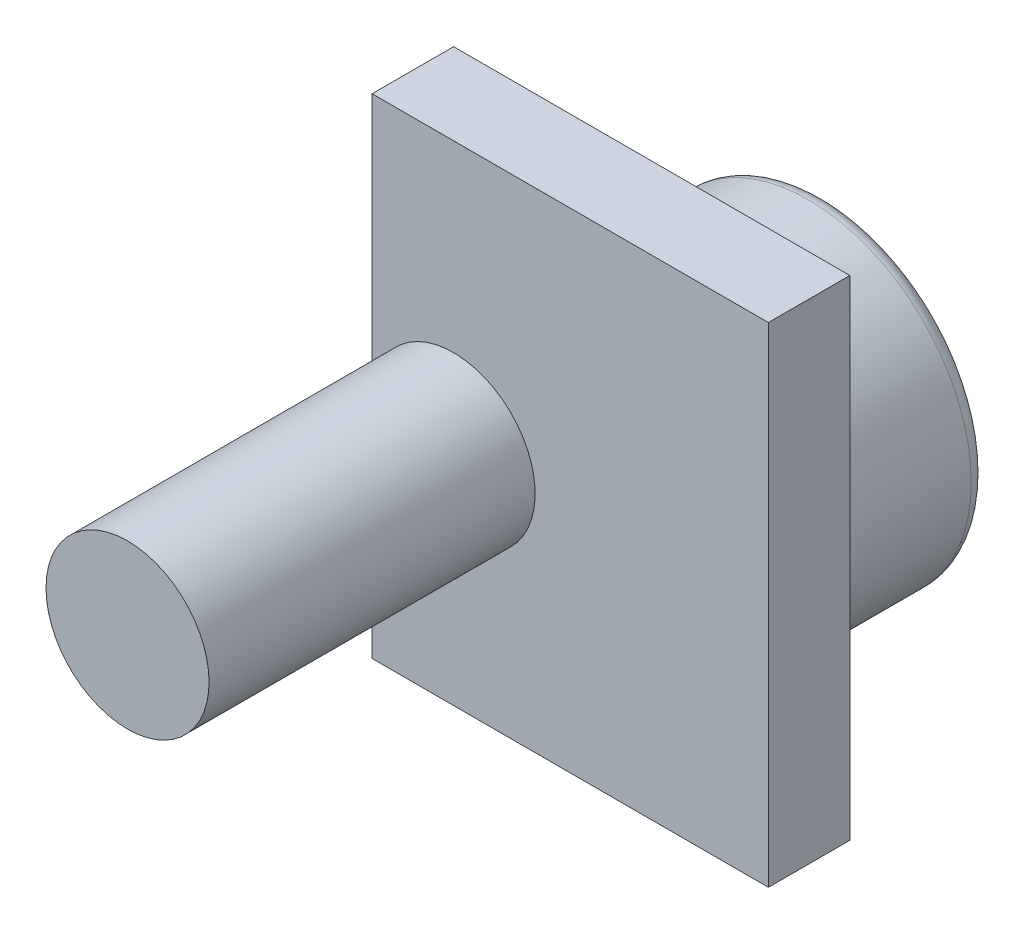
ISO-10303-21;
HEADER;
FILE_DESCRIPTION(('STEP AP214'),'2;1');
FILE_NAME('part.step','',(''),(''),'','','');
FILE_SCHEMA(('AUTOMOTIVE_DESIGN { 1 0 10303 214 1 1 1 1 }'));
ENDSEC;
DATA;
#1=APPLICATION_CONTEXT('core data for automotive mechanical design processes');
#2=APPLICATION_PROTOCOL_DEFINITION('international standard','automotive_design',2000,#1);
#3=PRODUCT_CONTEXT('',#1,'mechanical');
#4=PRODUCT('Part','Part','',(#3));
#5=PRODUCT_RELATED_PRODUCT_CATEGORY('part','',(#4));
#6=PRODUCT_DEFINITION_FORMATION('','',#4);
#7=PRODUCT_DEFINITION_CONTEXT('part definition',#1,'design');
#8=PRODUCT_DEFINITION('design','',#6,#7);
#9=PRODUCT_DEFINITION_SHAPE('','',#8);
#10=(LENGTH_UNIT() NAMED_UNIT(*) SI_UNIT(.MILLI.,.METRE.));
#11=(NAMED_UNIT(*) PLANE_ANGLE_UNIT() SI_UNIT($,.RADIAN.));
#12=(NAMED_UNIT(*) SI_UNIT($,.STERADIAN.) SOLID_ANGLE_UNIT());
#13=UNCERTAINTY_MEASURE_WITH_UNIT(LENGTH_MEASURE(1.E-05),#10,'distance_accuracy_value','');
#14=(GEOMETRIC_REPRESENTATION_CONTEXT(3) GLOBAL_UNCERTAINTY_ASSIGNED_CONTEXT((#13)) GLOBAL_UNIT_ASSIGNED_CONTEXT((#10,
#11,#12)) REPRESENTATION_CONTEXT('',''));
#15=CARTESIAN_POINT('',(0.,0.,0.));
#16=DIRECTION('',(0.,0.,1.));
#17=DIRECTION('',(1.,0.,0.));
#18=AXIS2_PLACEMENT_3D('',#15,#16,#17);
#19=CARTESIAN_POINT('',(-80.8676769495732,7.36758934161245,-3.6));
#20=DIRECTION('',(0.866025403784437,0.500000000000003,0.));
#21=DIRECTION('',(-0.500000000000003,0.866025403784437,0.));
#22=AXIS2_PLACEMENT_3D('',#19,#20,#21);
#23=PLANE('',#22);
#24=DIRECTION('',(0.500000000000003,-0.866025403784437,0.));
#25=VECTOR('',#24,1.);
#26=CARTESIAN_POINT('',(-80.8676769495732,7.36758934161245,-4.));
#27=LINE('',#26,#25);
#28=CARTESIAN_POINT('',(-80.8676769495732,7.36758934161245,-4.));
#29=VERTEX_POINT('',#28);
#30=CARTESIAN_POINT('',(-78.3676769495731,3.03746232269027,-4.));
#31=VERTEX_POINT('',#30);
#32=EDGE_CURVE('E107',#29,#31,#27,.T.);
#33=ORIENTED_EDGE('',*,*,#32,.F.);
#34=DIRECTION('',(0.,0.,-1.));
#35=VECTOR('',#34,1.);
#36=CARTESIAN_POINT('',(-80.8676769495732,7.36758934161245,-3.6));
#37=LINE('',#36,#35);
#38=CARTESIAN_POINT('',(-80.8676769495732,7.36758934161245,-3.6));
#39=VERTEX_POINT('',#38);
#40=EDGE_CURVE('E12',#39,#29,#37,.T.);
#41=ORIENTED_EDGE('',*,*,#40,.F.);
#42=DIRECTION('',(0.500000000000003,-0.866025403784437,0.));
#43=VECTOR('',#42,1.);
#44=CARTESIAN_POINT('',(-80.8676769495732,7.36758934161245,-3.6));
#45=LINE('',#44,#43);
#46=CARTESIAN_POINT('',(-78.3676769495731,3.03746232269027,-3.6));
#47=VERTEX_POINT('',#46);
#48=EDGE_CURVE('E99',#39,#47,#45,.T.);
#49=ORIENTED_EDGE('',*,*,#48,.T.);
#50=DIRECTION('',(0.,0.,-1.));
#51=VECTOR('',#50,1.);
#52=CARTESIAN_POINT('',(-78.3676769495731,3.03746232269027,-3.6));
#53=LINE('',#52,#51);
#54=EDGE_CURVE('E58',#47,#31,#53,.T.);
#55=ORIENTED_EDGE('',*,*,#54,.T.);
#56=EDGE_LOOP('',(#33,#41,#49,#55));
#57=FACE_BOUND('',#56,.T.);
#58=ADVANCED_FACE('F55',(#57),#23,.T.);
#59=CARTESIAN_POINT('',(-80.8676769495732,7.36758934161245,-3.6));
#60=DIRECTION('',(-0.866025403784439,0.499999999999999,0.));
#61=DIRECTION('',(-0.499999999999999,-0.866025403784439,0.));
#62=AXIS2_PLACEMENT_3D('',#59,#60,#61);
#63=PLANE('',#62);
#64=DIRECTION('',(0.499999999999999,0.866025403784439,0.));
#65=VECTOR('',#64,1.);
#66=CARTESIAN_POINT('',(-80.8676769495732,7.36758934161245,-4.));
#67=LINE('',#66,#65);
#68=CARTESIAN_POINT('',(-83.3676769495731,3.03746232269027,-4.));
#69=VERTEX_POINT('',#68);
#70=EDGE_CURVE('E101',#69,#29,#67,.T.);
#71=ORIENTED_EDGE('',*,*,#70,.F.);
#72=DIRECTION('',(0.,0.,-1.));
#73=VECTOR('',#72,1.);
#74=CARTESIAN_POINT('',(-83.3676769495731,3.03746232269027,-3.6));
#75=LINE('',#74,#73);
#76=CARTESIAN_POINT('',(-83.3676769495731,3.03746232269027,-3.6));
#77=VERTEX_POINT('',#76);
#78=EDGE_CURVE('E64',#77,#69,#75,.T.);
#79=ORIENTED_EDGE('',*,*,#78,.F.);
#80=DIRECTION('',(0.499999999999999,0.866025403784439,0.));
#81=VECTOR('',#80,1.);
#82=CARTESIAN_POINT('',(-80.8676769495732,7.36758934161245,-3.6));
#83=LINE('',#82,#81);
#84=EDGE_CURVE('E96',#77,#39,#83,.T.);
#85=ORIENTED_EDGE('',*,*,#84,.T.);
#86=ORIENTED_EDGE('',*,*,#40,.T.);
#87=EDGE_LOOP('',(#71,#79,#85,#86));
#88=FACE_BOUND('',#87,.T.);
#89=ADVANCED_FACE('F111',(#88),#63,.T.);
#90=CARTESIAN_POINT('',(-78.3676769495731,3.03746232269027,-3.6));
#91=DIRECTION('',(0.,-1.,0.));
#92=DIRECTION('',(1.,0.,0.));
#93=AXIS2_PLACEMENT_3D('',#90,#91,#92);
#94=PLANE('',#93);
#95=DIRECTION('',(-1.,0.,0.));
#96=VECTOR('',#95,1.);
#97=CARTESIAN_POINT('',(-78.3676769495731,3.03746232269027,-4.));
#98=LINE('',#97,#96);
#99=EDGE_CURVE('E94',#31,#69,#98,.T.);
#100=ORIENTED_EDGE('',*,*,#99,.F.);
#101=ORIENTED_EDGE('',*,*,#54,.F.);
#102=DIRECTION('',(-1.,0.,0.));
#103=VECTOR('',#102,1.);
#104=CARTESIAN_POINT('',(-78.3676769495731,3.03746232269027,-3.6));
#105=LINE('',#104,#103);
#106=EDGE_CURVE('E92',#47,#77,#105,.T.);
#107=ORIENTED_EDGE('',*,*,#106,.T.);
#108=ORIENTED_EDGE('',*,*,#78,.T.);
#109=EDGE_LOOP('',(#100,#101,#107,#108));
#110=FACE_BOUND('',#109,.T.);
#111=ADVANCED_FACE('F91',(#110),#94,.T.);
#112=CARTESIAN_POINT('',(0.,0.,-3.6));
#113=DIRECTION('',(0.,0.,-1.));
#114=DIRECTION('',(-1.,0.,0.));
#115=AXIS2_PLACEMENT_3D('',#112,#113,#114);
#116=PLANE('',#115);
#117=ORIENTED_EDGE('',*,*,#48,.F.);
#118=ORIENTED_EDGE('',*,*,#84,.F.);
#119=ORIENTED_EDGE('',*,*,#106,.F.);
#120=EDGE_LOOP('',(#117,#118,#119));
#121=FACE_BOUND('',#120,.T.);
#122=ADVANCED_FACE('F98',(#121),#116,.F.);
#123=CARTESIAN_POINT('',(0.,0.,-4.));
#124=DIRECTION('',(0.,0.,-1.));
#125=DIRECTION('',(-1.,0.,0.));
#126=AXIS2_PLACEMENT_3D('',#123,#124,#125);
#127=PLANE('',#126);
#128=ORIENTED_EDGE('',*,*,#32,.T.);
#129=ORIENTED_EDGE('',*,*,#99,.T.);
#130=ORIENTED_EDGE('',*,*,#70,.T.);
#131=EDGE_LOOP('',(#128,#129,#130));
#132=FACE_BOUND('',#131,.T.);
#133=ADVANCED_FACE('F110',(#132),#127,.T.);
#134=CLOSED_SHELL('',(#58,#89,#111,#122,#133));
#135=MANIFOLD_SOLID_BREP('B2',#134);
#136=CARTESIAN_POINT('',(-80.8676769495731,4.56758934161245,-4.));
#137=DIRECTION('',(0.,0.,1.));
#138=DIRECTION('',(1.,0.,0.));
#139=AXIS2_PLACEMENT_3D('',#136,#137,#138);
#140=CYLINDRICAL_SURFACE('',#139,4.00000000000001);
#141=CARTESIAN_POINT('',(-80.8676769495731,4.56758934161245,-3.6));
#142=DIRECTION('',(0.,0.,1.));
#143=DIRECTION('',(1.,0.,0.));
#144=AXIS2_PLACEMENT_3D('',#141,#142,#143);
#145=CIRCLE('',#144,4.00000000000001);
#146=CARTESIAN_POINT('',(-76.8676769495731,4.56758934161245,-3.6));
#147=VERTEX_POINT('',#146);
#148=EDGE_CURVE('E172',#147,#147,#145,.T.);
#149=ORIENTED_EDGE('',*,*,#148,.T.);
#150=EDGE_LOOP('',(#149));
#151=FACE_BOUND('',#150,.T.);
#152=CARTESIAN_POINT('',(-80.8676769495731,4.56758934161245,0.));
#153=DIRECTION('',(0.,0.,1.));
#154=DIRECTION('',(1.,0.,0.));
#155=AXIS2_PLACEMENT_3D('',#152,#153,#154);
#156=CIRCLE('',#155,4.00000000000001);
#157=CARTESIAN_POINT('',(-76.8676769495731,4.56758934161245,0.));
#158=VERTEX_POINT('',#157);
#159=EDGE_CURVE('E318',#158,#158,#156,.T.);
#160=ORIENTED_EDGE('',*,*,#159,.F.);
#161=EDGE_LOOP('',(#160));
#162=FACE_BOUND('',#161,.T.);
#163=ADVANCED_FACE('F163',(#151,#162),#140,.T.);
#164=CARTESIAN_POINT('',(-80.8676769495731,4.56758934161245,-4.));
#165=DIRECTION('',(0.,0.,1.));
#166=DIRECTION('',(1.,0.,0.));
#167=AXIS2_PLACEMENT_3D('',#164,#165,#166);
#168=PLANE('',#167);
#169=DIRECTION('',(-1.,0.,0.));
#170=VECTOR('',#169,1.);
#171=CARTESIAN_POINT('',(-78.3676769495731,3.03746232269027,-4.));
#172=LINE('',#171,#170);
#173=CARTESIAN_POINT('',(-78.3676769495731,3.03746232269027,-4.));
#174=VERTEX_POINT('',#173);
#175=CARTESIAN_POINT('',(-83.3676769495731,3.03746232269027,-4.));
#176=VERTEX_POINT('',#175);
#177=EDGE_CURVE('E259',#174,#176,#172,.T.);
#178=ORIENTED_EDGE('',*,*,#177,.F.);
#179=DIRECTION('',(0.500000000000003,-0.866025403784437,0.));
#180=VECTOR('',#179,1.);
#181=CARTESIAN_POINT('',(-80.8676769495732,7.36758934161245,-4.));
#182=LINE('',#181,#180);
#183=CARTESIAN_POINT('',(-80.8676769495732,7.36758934161245,-4.));
#184=VERTEX_POINT('',#183);
#185=EDGE_CURVE('E179',#184,#174,#182,.T.);
#186=ORIENTED_EDGE('',*,*,#185,.F.);
#187=DIRECTION('',(0.499999999999999,0.866025403784439,0.));
#188=VECTOR('',#187,1.);
#189=CARTESIAN_POINT('',(-80.8676769495732,7.36758934161245,-4.));
#190=LINE('',#189,#188);
#191=EDGE_CURVE('E255',#176,#184,#190,.T.);
#192=ORIENTED_EDGE('',*,*,#191,.F.);
#193=EDGE_LOOP('',(#178,#186,#192));
#194=FACE_BOUND('',#193,.T.);
#195=CARTESIAN_POINT('',(-80.8676769495731,4.56758934161245,-4.));
#196=DIRECTION('',(0.,0.,1.));
#197=DIRECTION('',(1.,0.,0.));
#198=AXIS2_PLACEMENT_3D('',#195,#196,#197);
#199=CIRCLE('',#198,3.60000000000001);
#200=CARTESIAN_POINT('',(-77.2676769495731,4.56758934161245,-4.));
#201=VERTEX_POINT('',#200);
#202=EDGE_CURVE('E53',#201,#201,#199,.F.);
#203=ORIENTED_EDGE('',*,*,#202,.T.);
#204=EDGE_LOOP('',(#203));
#205=FACE_BOUND('',#204,.T.);
#206=ADVANCED_FACE('F343',(#194,#205),#168,.F.);
#207=CARTESIAN_POINT('',(-85.9676769495731,11.0675893416125,2.));
#208=DIRECTION('',(1.,0.,0.));
#209=DIRECTION('',(0.,0.,-1.));
#210=AXIS2_PLACEMENT_3D('',#207,#208,#209);
#211=PLANE('',#210);
#212=DIRECTION('',(0.,-1.,0.));
#213=VECTOR('',#212,1.);
#214=CARTESIAN_POINT('',(-85.9676769495731,11.0675893416125,0.));
#215=LINE('',#214,#213);
#216=CARTESIAN_POINT('',(-85.9676769495731,11.0675893416125,0.));
#217=VERTEX_POINT('',#216);
#218=CARTESIAN_POINT('',(-85.9676769495731,-0.932410658387546,0.));
#219=VERTEX_POINT('',#218);
#220=EDGE_CURVE('E278',#217,#219,#215,.T.);
#221=ORIENTED_EDGE('',*,*,#220,.T.);
#222=DIRECTION('',(0.,0.,-1.));
#223=VECTOR('',#222,1.);
#224=CARTESIAN_POINT('',(-85.9676769495731,-0.932410658387546,2.));
#225=LINE('',#224,#223);
#226=CARTESIAN_POINT('',(-85.9676769495731,-0.932410658387546,2.));
#227=VERTEX_POINT('',#226);
#228=EDGE_CURVE('E314',#227,#219,#225,.T.);
#229=ORIENTED_EDGE('',*,*,#228,.F.);
#230=DIRECTION('',(0.,-1.,0.));
#231=VECTOR('',#230,1.);
#232=CARTESIAN_POINT('',(-85.9676769495731,11.0675893416125,2.));
#233=LINE('',#232,#231);
#234=CARTESIAN_POINT('',(-85.9676769495731,4.56758934161245,2.));
#235=VERTEX_POINT('',#234);
#236=EDGE_CURVE('E216',#235,#227,#233,.T.);
#237=ORIENTED_EDGE('',*,*,#236,.F.);
#238=CARTESIAN_POINT('',(-85.9676769495731,11.0675893416125,2.));
#239=VERTEX_POINT('',#238);
#240=EDGE_CURVE('E282',#239,#235,#233,.T.);
#241=ORIENTED_EDGE('',*,*,#240,.F.);
#242=DIRECTION('',(0.,0.,-1.));
#243=VECTOR('',#242,1.);
#244=CARTESIAN_POINT('',(-85.9676769495731,11.0675893416125,2.));
#245=LINE('',#244,#243);
#246=EDGE_CURVE('E293',#239,#217,#245,.T.);
#247=ORIENTED_EDGE('',*,*,#246,.T.);
#248=EDGE_LOOP('',(#221,#229,#237,#241,#247));
#249=FACE_BOUND('',#248,.T.);
#250=ADVANCED_FACE('F347',(#249),#211,.F.);
#251=CARTESIAN_POINT('',(-85.9676769495731,-0.932410658387546,2.));
#252=DIRECTION('',(0.,1.,0.));
#253=DIRECTION('',(0.,0.,1.));
#254=AXIS2_PLACEMENT_3D('',#251,#252,#253);
#255=PLANE('',#254);
#256=DIRECTION('',(1.,0.,0.));
#257=VECTOR('',#256,1.);
#258=CARTESIAN_POINT('',(-85.9676769495731,-0.932410658387546,0.));
#259=LINE('',#258,#257);
#260=CARTESIAN_POINT('',(-76.2445096963185,-0.932410658387546,0.));
#261=VERTEX_POINT('',#260);
#262=EDGE_CURVE('E297',#219,#261,#259,.T.);
#263=ORIENTED_EDGE('',*,*,#262,.T.);
#264=DIRECTION('',(0.,0.,-1.));
#265=VECTOR('',#264,1.);
#266=CARTESIAN_POINT('',(-76.2445096963185,-0.932410658387546,2.));
#267=LINE('',#266,#265);
#268=CARTESIAN_POINT('',(-76.2445096963185,-0.932410658387546,2.));
#269=VERTEX_POINT('',#268);
#270=EDGE_CURVE('E310',#269,#261,#267,.T.);
#271=ORIENTED_EDGE('',*,*,#270,.F.);
#272=DIRECTION('',(1.,0.,0.));
#273=VECTOR('',#272,1.);
#274=CARTESIAN_POINT('',(-85.9676769495731,-0.932410658387546,2.));
#275=LINE('',#274,#273);
#276=EDGE_CURVE('E285',#227,#269,#275,.T.);
#277=ORIENTED_EDGE('',*,*,#276,.F.);
#278=ORIENTED_EDGE('',*,*,#228,.T.);
#279=EDGE_LOOP('',(#263,#271,#277,#278));
#280=FACE_BOUND('',#279,.T.);
#281=ADVANCED_FACE('F353',(#280),#255,.F.);
#282=CARTESIAN_POINT('',(-76.2445096963185,11.0675893416125,2.));
#283=DIRECTION('',(-1.,0.,0.));
#284=DIRECTION('',(0.,0.,1.));
#285=AXIS2_PLACEMENT_3D('',#282,#283,#284);
#286=PLANE('',#285);
#287=DIRECTION('',(0.,1.,0.));
#288=VECTOR('',#287,1.);
#289=CARTESIAN_POINT('',(-76.2445096963185,11.0675893416125,0.));
#290=LINE('',#289,#288);
#291=CARTESIAN_POINT('',(-76.2445096963185,11.0675893416125,0.));
#292=VERTEX_POINT('',#291);
#293=EDGE_CURVE('E300',#261,#292,#290,.T.);
#294=ORIENTED_EDGE('',*,*,#293,.T.);
#295=DIRECTION('',(0.,0.,-1.));
#296=VECTOR('',#295,1.);
#297=CARTESIAN_POINT('',(-76.2445096963185,11.0675893416125,2.));
#298=LINE('',#297,#296);
#299=CARTESIAN_POINT('',(-76.2445096963185,11.0675893416125,2.));
#300=VERTEX_POINT('',#299);
#301=EDGE_CURVE('E307',#300,#292,#298,.T.);
#302=ORIENTED_EDGE('',*,*,#301,.F.);
#303=DIRECTION('',(0.,1.,0.));
#304=VECTOR('',#303,1.);
#305=CARTESIAN_POINT('',(-76.2445096963185,11.0675893416125,2.));
#306=LINE('',#305,#304);
#307=EDGE_CURVE('E288',#269,#300,#306,.T.);
#308=ORIENTED_EDGE('',*,*,#307,.F.);
#309=ORIENTED_EDGE('',*,*,#270,.T.);
#310=EDGE_LOOP('',(#294,#302,#308,#309));
#311=FACE_BOUND('',#310,.T.);
#312=ADVANCED_FACE('F357',(#311),#286,.F.);
#313=CARTESIAN_POINT('',(-85.9676769495731,11.0675893416125,2.));
#314=DIRECTION('',(0.,-1.,0.));
#315=DIRECTION('',(0.,0.,-1.));
#316=AXIS2_PLACEMENT_3D('',#313,#314,#315);
#317=PLANE('',#316);
#318=DIRECTION('',(-1.,0.,0.));
#319=VECTOR('',#318,1.);
#320=CARTESIAN_POINT('',(-85.9676769495731,11.0675893416125,0.));
#321=LINE('',#320,#319);
#322=EDGE_CURVE('E209',#292,#217,#321,.T.);
#323=ORIENTED_EDGE('',*,*,#322,.T.);
#324=ORIENTED_EDGE('',*,*,#246,.F.);
#325=DIRECTION('',(-1.,0.,0.));
#326=VECTOR('',#325,1.);
#327=CARTESIAN_POINT('',(-85.9676769495731,11.0675893416125,2.));
#328=LINE('',#327,#326);
#329=EDGE_CURVE('E188',#300,#239,#328,.T.);
#330=ORIENTED_EDGE('',*,*,#329,.F.);
#331=ORIENTED_EDGE('',*,*,#301,.T.);
#332=EDGE_LOOP('',(#323,#324,#330,#331));
#333=FACE_BOUND('',#332,.T.);
#334=ADVANCED_FACE('F361',(#333),#317,.F.);
#335=CARTESIAN_POINT('',(0.,0.,2.));
#336=DIRECTION('',(0.,0.,1.));
#337=DIRECTION('',(1.,0.,0.));
#338=AXIS2_PLACEMENT_3D('',#335,#336,#337);
#339=PLANE('',#338);
#340=ORIENTED_EDGE('',*,*,#240,.T.);
#341=CARTESIAN_POINT('',(-83.9676769495731,4.56758934161245,2.));
#342=DIRECTION('',(0.,0.,1.));
#343=DIRECTION('',(1.,0.,0.));
#344=AXIS2_PLACEMENT_3D('',#341,#342,#343);
#345=CIRCLE('',#344,2.);
#346=EDGE_CURVE('E271',#235,#235,#345,.T.);
#347=ORIENTED_EDGE('',*,*,#346,.F.);
#348=ORIENTED_EDGE('',*,*,#236,.T.);
#349=ORIENTED_EDGE('',*,*,#276,.T.);
#350=ORIENTED_EDGE('',*,*,#307,.T.);
#351=ORIENTED_EDGE('',*,*,#329,.T.);
#352=EDGE_LOOP('',(#340,#347,#348,#349,#350,#351));
#353=FACE_BOUND('',#352,.T.);
#354=ADVANCED_FACE('F338',(#353),#339,.T.);
#355=CARTESIAN_POINT('',(0.,0.,0.));
#356=DIRECTION('',(0.,0.,1.));
#357=DIRECTION('',(1.,0.,0.));
#358=AXIS2_PLACEMENT_3D('',#355,#356,#357);
#359=PLANE('',#358);
#360=ORIENTED_EDGE('',*,*,#159,.T.);
#361=EDGE_LOOP('',(#360));
#362=FACE_BOUND('',#361,.T.);
#363=ORIENTED_EDGE('',*,*,#220,.F.);
#364=ORIENTED_EDGE('',*,*,#322,.F.);
#365=ORIENTED_EDGE('',*,*,#293,.F.);
#366=ORIENTED_EDGE('',*,*,#262,.F.);
#367=EDGE_LOOP('',(#363,#364,#365,#366));
#368=FACE_BOUND('',#367,.T.);
#369=ADVANCED_FACE('F329',(#362,#368),#359,.F.);
#370=CARTESIAN_POINT('',(-80.8676769495731,4.56758934161245,-3.6));
#371=DIRECTION('',(0.,0.,1.));
#372=DIRECTION('',(1.,0.,0.));
#373=AXIS2_PLACEMENT_3D('',#370,#371,#372);
#374=TOROIDAL_SURFACE('',#373,3.60000000000001,0.4);
#375=ORIENTED_EDGE('',*,*,#202,.F.);
#376=EDGE_LOOP('',(#375));
#377=FACE_BOUND('',#376,.T.);
#378=ORIENTED_EDGE('',*,*,#148,.F.);
#379=EDGE_LOOP('',(#378));
#380=FACE_BOUND('',#379,.T.);
#381=ADVANCED_FACE('F165',(#377,#380),#374,.T.);
#382=CARTESIAN_POINT('',(-83.9676769495731,4.56758934161245,10.));
#383=DIRECTION('',(0.,0.,-1.));
#384=DIRECTION('',(-1.,0.,0.));
#385=AXIS2_PLACEMENT_3D('',#382,#383,#384);
#386=CYLINDRICAL_SURFACE('',#385,2.);
#387=CARTESIAN_POINT('',(-83.9676769495731,4.56758934161245,10.));
#388=DIRECTION('',(0.,0.,1.));
#389=DIRECTION('',(1.,0.,0.));
#390=AXIS2_PLACEMENT_3D('',#387,#388,#389);
#391=CIRCLE('',#390,2.);
#392=CARTESIAN_POINT('',(-81.9676769495731,4.56758934161245,10.));
#393=VERTEX_POINT('',#392);
#394=EDGE_CURVE('E274',#393,#393,#391,.T.);
#395=ORIENTED_EDGE('',*,*,#394,.F.);
#396=EDGE_LOOP('',(#395));
#397=FACE_BOUND('',#396,.T.);
#398=ORIENTED_EDGE('',*,*,#346,.T.);
#399=EDGE_LOOP('',(#398));
#400=FACE_BOUND('',#399,.T.);
#401=ADVANCED_FACE('F328',(#397,#400),#386,.T.);
#402=CARTESIAN_POINT('',(-83.9676769495731,4.56758934161245,10.));
#403=DIRECTION('',(0.,0.,1.));
#404=DIRECTION('',(1.,0.,0.));
#405=AXIS2_PLACEMENT_3D('',#402,#403,#404);
#406=PLANE('',#405);
#407=ORIENTED_EDGE('',*,*,#394,.T.);
#408=EDGE_LOOP('',(#407));
#409=FACE_BOUND('',#408,.T.);
#410=ADVANCED_FACE('F335',(#409),#406,.T.);
#411=CARTESIAN_POINT('',(-80.8676769495732,7.36758934161245,-3.6));
#412=DIRECTION('',(0.866025403784437,0.500000000000003,0.));
#413=DIRECTION('',(-0.500000000000003,0.866025403784437,0.));
#414=AXIS2_PLACEMENT_3D('',#411,#412,#413);
#415=PLANE('',#414);
#416=ORIENTED_EDGE('',*,*,#185,.T.);
#417=DIRECTION('',(0.,0.,-1.));
#418=VECTOR('',#417,1.);
#419=CARTESIAN_POINT('',(-78.3676769495731,3.03746232269027,-3.6));
#420=LINE('',#419,#418);
#421=CARTESIAN_POINT('',(-78.3676769495731,3.03746232269027,-3.6));
#422=VERTEX_POINT('',#421);
#423=EDGE_CURVE('E233',#422,#174,#420,.T.);
#424=ORIENTED_EDGE('',*,*,#423,.F.);
#425=DIRECTION('',(0.500000000000003,-0.866025403784437,0.));
#426=VECTOR('',#425,1.);
#427=CARTESIAN_POINT('',(-80.8676769495732,7.36758934161245,-3.6));
#428=LINE('',#427,#426);
#429=CARTESIAN_POINT('',(-80.8676769495732,7.36758934161245,-3.6));
#430=VERTEX_POINT('',#429);
#431=EDGE_CURVE('E237',#430,#422,#428,.T.);
#432=ORIENTED_EDGE('',*,*,#431,.F.);
#433=DIRECTION('',(0.,0.,-1.));
#434=VECTOR('',#433,1.);
#435=CARTESIAN_POINT('',(-80.8676769495732,7.36758934161245,-3.6));
#436=LINE('',#435,#434);
#437=EDGE_CURVE('E268',#430,#184,#436,.T.);
#438=ORIENTED_EDGE('',*,*,#437,.T.);
#439=EDGE_LOOP('',(#416,#424,#432,#438));
#440=FACE_BOUND('',#439,.T.);
#441=ADVANCED_FACE('F235',(#440),#415,.F.);
#442=CARTESIAN_POINT('',(-80.8676769495732,7.36758934161245,-3.6));
#443=DIRECTION('',(-0.866025403784439,0.499999999999999,0.));
#444=DIRECTION('',(-0.499999999999999,-0.866025403784439,0.));
#445=AXIS2_PLACEMENT_3D('',#442,#443,#444);
#446=PLANE('',#445);
#447=ORIENTED_EDGE('',*,*,#191,.T.);
#448=ORIENTED_EDGE('',*,*,#437,.F.);
#449=DIRECTION('',(0.499999999999999,0.866025403784439,0.));
#450=VECTOR('',#449,1.);
#451=CARTESIAN_POINT('',(-80.8676769495732,7.36758934161245,-3.6));
#452=LINE('',#451,#450);
#453=CARTESIAN_POINT('',(-83.3676769495731,3.03746232269027,-3.6));
#454=VERTEX_POINT('',#453);
#455=EDGE_CURVE('E244',#454,#430,#452,.T.);
#456=ORIENTED_EDGE('',*,*,#455,.F.);
#457=DIRECTION('',(0.,0.,-1.));
#458=VECTOR('',#457,1.);
#459=CARTESIAN_POINT('',(-83.3676769495731,3.03746232269027,-3.6));
#460=LINE('',#459,#458);
#461=EDGE_CURVE('E243',#454,#176,#460,.T.);
#462=ORIENTED_EDGE('',*,*,#461,.T.);
#463=EDGE_LOOP('',(#447,#448,#456,#462));
#464=FACE_BOUND('',#463,.T.);
#465=ADVANCED_FACE('F372',(#464),#446,.F.);
#466=CARTESIAN_POINT('',(-78.3676769495731,3.03746232269027,-3.6));
#467=DIRECTION('',(0.,-1.,0.));
#468=DIRECTION('',(1.,0.,0.));
#469=AXIS2_PLACEMENT_3D('',#466,#467,#468);
#470=PLANE('',#469);
#471=ORIENTED_EDGE('',*,*,#177,.T.);
#472=ORIENTED_EDGE('',*,*,#461,.F.);
#473=DIRECTION('',(-1.,0.,0.));
#474=VECTOR('',#473,1.);
#475=CARTESIAN_POINT('',(-78.3676769495731,3.03746232269027,-3.6));
#476=LINE('',#475,#474);
#477=EDGE_CURVE('E247',#422,#454,#476,.T.);
#478=ORIENTED_EDGE('',*,*,#477,.F.);
#479=ORIENTED_EDGE('',*,*,#423,.T.);
#480=EDGE_LOOP('',(#471,#472,#478,#479));
#481=FACE_BOUND('',#480,.T.);
#482=ADVANCED_FACE('F248',(#481),#470,.F.);
#483=CARTESIAN_POINT('',(0.,0.,-3.6));
#484=DIRECTION('',(0.,0.,-1.));
#485=DIRECTION('',(-1.,0.,0.));
#486=AXIS2_PLACEMENT_3D('',#483,#484,#485);
#487=PLANE('',#486);
#488=ORIENTED_EDGE('',*,*,#431,.T.);
#489=ORIENTED_EDGE('',*,*,#477,.T.);
#490=ORIENTED_EDGE('',*,*,#455,.T.);
#491=EDGE_LOOP('',(#488,#489,#490));
#492=FACE_BOUND('',#491,.T.);
#493=ADVANCED_FACE('F253',(#492),#487,.T.);
#494=CLOSED_SHELL('',(#163,#206,#250,#281,#312,#334,#354,#369,#381,#401,#410,#441,#465,#482,#493));
#495=MANIFOLD_SOLID_BREP('B6',#494);
#496=ADVANCED_BREP_SHAPE_REPRESENTATION('',(#18,#135,#495),#14);
#497=SHAPE_DEFINITION_REPRESENTATION(#9,#496);
ENDSEC;
END-ISO-10303-21;
